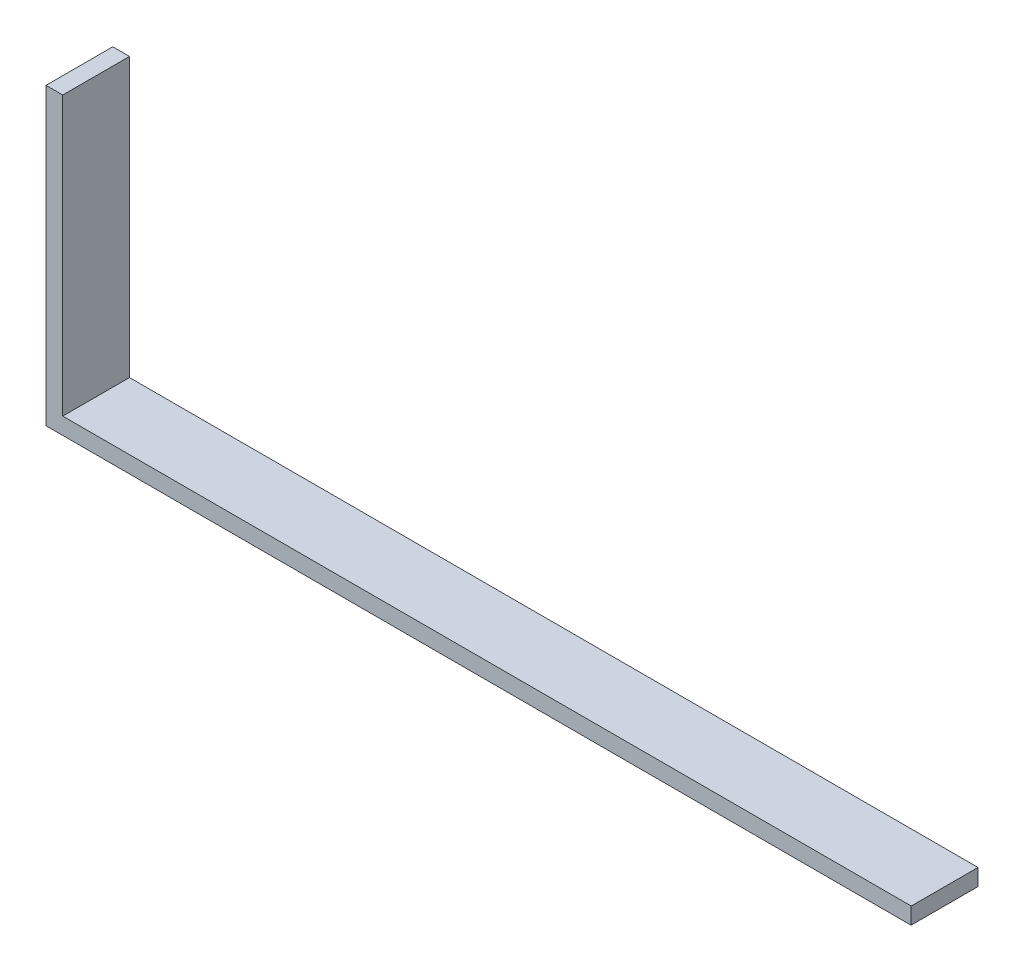
ISO-10303-21;
HEADER;
FILE_DESCRIPTION(('STEP AP214'),'2;1');
FILE_NAME('part.step','',(''),(''),'','','');
FILE_SCHEMA(('AUTOMOTIVE_DESIGN { 1 0 10303 214 1 1 1 1 }'));
ENDSEC;
DATA;
#1=APPLICATION_CONTEXT('core data for automotive mechanical design processes');
#2=APPLICATION_PROTOCOL_DEFINITION('international standard','automotive_design',2000,#1);
#3=PRODUCT_CONTEXT('',#1,'mechanical');
#4=PRODUCT('Part','Part','',(#3));
#5=PRODUCT_RELATED_PRODUCT_CATEGORY('part','',(#4));
#6=PRODUCT_DEFINITION_FORMATION('','',#4);
#7=PRODUCT_DEFINITION_CONTEXT('part definition',#1,'design');
#8=PRODUCT_DEFINITION('design','',#6,#7);
#9=PRODUCT_DEFINITION_SHAPE('','',#8);
#10=(LENGTH_UNIT() NAMED_UNIT(*) SI_UNIT(.MILLI.,.METRE.));
#11=(NAMED_UNIT(*) PLANE_ANGLE_UNIT() SI_UNIT($,.RADIAN.));
#12=(NAMED_UNIT(*) SI_UNIT($,.STERADIAN.) SOLID_ANGLE_UNIT());
#13=UNCERTAINTY_MEASURE_WITH_UNIT(LENGTH_MEASURE(1.E-05),#10,'distance_accuracy_value','');
#14=(GEOMETRIC_REPRESENTATION_CONTEXT(3) GLOBAL_UNCERTAINTY_ASSIGNED_CONTEXT((#13)) GLOBAL_UNIT_ASSIGNED_CONTEXT((#10,
#11,#12)) REPRESENTATION_CONTEXT('',''));
#15=CARTESIAN_POINT('',(0.,0.,0.));
#16=DIRECTION('',(0.,0.,1.));
#17=DIRECTION('',(1.,0.,0.));
#18=AXIS2_PLACEMENT_3D('',#15,#16,#17);
#19=CARTESIAN_POINT('',(0.,-211.585,50.8));
#20=DIRECTION('',(0.,-1.,0.));
#21=DIRECTION('',(0.,0.,-1.));
#22=AXIS2_PLACEMENT_3D('',#19,#20,#21);
#23=PLANE('',#22);
#24=DIRECTION('',(-1.,0.,0.));
#25=VECTOR('',#24,1.);
#26=CARTESIAN_POINT('',(0.,-211.585,0.));
#27=LINE('',#26,#25);
#28=CARTESIAN_POINT('',(645.545,-211.585,0.));
#29=VERTEX_POINT('',#28);
#30=CARTESIAN_POINT('',(0.,-211.585,0.));
#31=VERTEX_POINT('',#30);
#32=EDGE_CURVE('E117',#29,#31,#27,.T.);
#33=ORIENTED_EDGE('',*,*,#32,.T.);
#34=DIRECTION('',(0.,0.,-1.));
#35=VECTOR('',#34,1.);
#36=CARTESIAN_POINT('',(0.,-211.585,50.8));
#37=LINE('',#36,#35);
#38=CARTESIAN_POINT('',(0.,-211.585,50.8));
#39=VERTEX_POINT('',#38);
#40=EDGE_CURVE('E11',#39,#31,#37,.T.);
#41=ORIENTED_EDGE('',*,*,#40,.F.);
#42=DIRECTION('',(-1.,0.,0.));
#43=VECTOR('',#42,1.);
#44=CARTESIAN_POINT('',(0.,-211.585,50.8));
#45=LINE('',#44,#43);
#46=CARTESIAN_POINT('',(645.545,-211.585,50.8));
#47=VERTEX_POINT('',#46);
#48=EDGE_CURVE('E127',#47,#39,#45,.T.);
#49=ORIENTED_EDGE('',*,*,#48,.F.);
#50=DIRECTION('',(0.,0.,-1.));
#51=VECTOR('',#50,1.);
#52=CARTESIAN_POINT('',(645.545,-211.585,50.8));
#53=LINE('',#52,#51);
#54=EDGE_CURVE('E113',#47,#29,#53,.T.);
#55=ORIENTED_EDGE('',*,*,#54,.T.);
#56=EDGE_LOOP('',(#33,#41,#49,#55));
#57=FACE_BOUND('',#56,.T.);
#58=ADVANCED_FACE('F33',(#57),#23,.F.);
#59=CARTESIAN_POINT('',(0.,0.,50.8));
#60=DIRECTION('',(-1.,0.,0.));
#61=DIRECTION('',(0.,0.,1.));
#62=AXIS2_PLACEMENT_3D('',#59,#60,#61);
#63=PLANE('',#62);
#64=DIRECTION('',(0.,1.,0.));
#65=VECTOR('',#64,1.);
#66=CARTESIAN_POINT('',(0.,0.,0.));
#67=LINE('',#66,#65);
#68=CARTESIAN_POINT('',(0.,0.,0.));
#69=VERTEX_POINT('',#68);
#70=EDGE_CURVE('E120',#31,#69,#67,.T.);
#71=ORIENTED_EDGE('',*,*,#70,.T.);
#72=DIRECTION('',(0.,0.,-1.));
#73=VECTOR('',#72,1.);
#74=CARTESIAN_POINT('',(0.,0.,50.8));
#75=LINE('',#74,#73);
#76=CARTESIAN_POINT('',(0.,0.,50.8));
#77=VERTEX_POINT('',#76);
#78=EDGE_CURVE('E41',#77,#69,#75,.T.);
#79=ORIENTED_EDGE('',*,*,#78,.F.);
#80=DIRECTION('',(0.,1.,0.));
#81=VECTOR('',#80,1.);
#82=CARTESIAN_POINT('',(0.,0.,50.8));
#83=LINE('',#82,#81);
#84=EDGE_CURVE('E86',#39,#77,#83,.T.);
#85=ORIENTED_EDGE('',*,*,#84,.F.);
#86=ORIENTED_EDGE('',*,*,#40,.T.);
#87=EDGE_LOOP('',(#71,#79,#85,#86));
#88=FACE_BOUND('',#87,.T.);
#89=ADVANCED_FACE('F151',(#88),#63,.F.);
#90=CARTESIAN_POINT('',(-12.7200000000001,0.,50.8));
#91=DIRECTION('',(0.,-1.,0.));
#92=DIRECTION('',(0.,0.,-1.));
#93=AXIS2_PLACEMENT_3D('',#90,#91,#92);
#94=PLANE('',#93);
#95=DIRECTION('',(-1.,0.,0.));
#96=VECTOR('',#95,1.);
#97=CARTESIAN_POINT('',(-12.7200000000001,0.,0.));
#98=LINE('',#97,#96);
#99=CARTESIAN_POINT('',(-12.7200000000001,0.,0.));
#100=VERTEX_POINT('',#99);
#101=EDGE_CURVE('E122',#69,#100,#98,.T.);
#102=ORIENTED_EDGE('',*,*,#101,.T.);
#103=DIRECTION('',(0.,0.,-1.));
#104=VECTOR('',#103,1.);
#105=CARTESIAN_POINT('',(-12.7200000000001,0.,50.8));
#106=LINE('',#105,#104);
#107=CARTESIAN_POINT('',(-12.7200000000001,0.,50.8));
#108=VERTEX_POINT('',#107);
#109=EDGE_CURVE('E108',#108,#100,#106,.T.);
#110=ORIENTED_EDGE('',*,*,#109,.F.);
#111=DIRECTION('',(-1.,0.,0.));
#112=VECTOR('',#111,1.);
#113=CARTESIAN_POINT('',(-12.7200000000001,0.,50.8));
#114=LINE('',#113,#112);
#115=EDGE_CURVE('E99',#77,#108,#114,.T.);
#116=ORIENTED_EDGE('',*,*,#115,.F.);
#117=ORIENTED_EDGE('',*,*,#78,.T.);
#118=EDGE_LOOP('',(#102,#110,#116,#117));
#119=FACE_BOUND('',#118,.T.);
#120=ADVANCED_FACE('F133',(#119),#94,.F.);
#121=CARTESIAN_POINT('',(-12.7200000000001,-224.305,50.8));
#122=DIRECTION('',(1.,0.,0.));
#123=DIRECTION('',(0.,0.,-1.));
#124=AXIS2_PLACEMENT_3D('',#121,#122,#123);
#125=PLANE('',#124);
#126=DIRECTION('',(0.,-1.,0.));
#127=VECTOR('',#126,1.);
#128=CARTESIAN_POINT('',(-12.7200000000001,-224.305,0.));
#129=LINE('',#128,#127);
#130=CARTESIAN_POINT('',(-12.7200000000001,-224.305,0.));
#131=VERTEX_POINT('',#130);
#132=EDGE_CURVE('E107',#100,#131,#129,.T.);
#133=ORIENTED_EDGE('',*,*,#132,.T.);
#134=DIRECTION('',(0.,0.,-1.));
#135=VECTOR('',#134,1.);
#136=CARTESIAN_POINT('',(-12.7200000000001,-224.305,50.8));
#137=LINE('',#136,#135);
#138=CARTESIAN_POINT('',(-12.7200000000001,-224.305,50.8));
#139=VERTEX_POINT('',#138);
#140=EDGE_CURVE('E104',#139,#131,#137,.T.);
#141=ORIENTED_EDGE('',*,*,#140,.F.);
#142=DIRECTION('',(0.,-1.,0.));
#143=VECTOR('',#142,1.);
#144=CARTESIAN_POINT('',(-12.7200000000001,-224.305,50.8));
#145=LINE('',#144,#143);
#146=EDGE_CURVE('E93',#108,#139,#145,.T.);
#147=ORIENTED_EDGE('',*,*,#146,.F.);
#148=ORIENTED_EDGE('',*,*,#109,.T.);
#149=EDGE_LOOP('',(#133,#141,#147,#148));
#150=FACE_BOUND('',#149,.T.);
#151=ADVANCED_FACE('F105',(#150),#125,.F.);
#152=CARTESIAN_POINT('',(645.445,-224.305,50.8));
#153=DIRECTION('',(0.,1.,0.));
#154=DIRECTION('',(-1.,0.,0.));
#155=AXIS2_PLACEMENT_3D('',#152,#153,#154);
#156=PLANE('',#155);
#157=DIRECTION('',(1.,0.,0.));
#158=VECTOR('',#157,1.);
#159=CARTESIAN_POINT('',(645.445,-224.305,0.));
#160=LINE('',#159,#158);
#161=CARTESIAN_POINT('',(645.445,-224.305,0.));
#162=VERTEX_POINT('',#161);
#163=EDGE_CURVE('E72',#131,#162,#160,.T.);
#164=ORIENTED_EDGE('',*,*,#163,.T.);
#165=DIRECTION('',(0.,0.,-1.));
#166=VECTOR('',#165,1.);
#167=CARTESIAN_POINT('',(645.445,-224.305,50.8));
#168=LINE('',#167,#166);
#169=CARTESIAN_POINT('',(645.445,-224.305,50.8));
#170=VERTEX_POINT('',#169);
#171=EDGE_CURVE('E109',#170,#162,#168,.T.);
#172=ORIENTED_EDGE('',*,*,#171,.F.);
#173=DIRECTION('',(1.,0.,0.));
#174=VECTOR('',#173,1.);
#175=CARTESIAN_POINT('',(645.445,-224.305,50.8));
#176=LINE('',#175,#174);
#177=EDGE_CURVE('E97',#139,#170,#176,.T.);
#178=ORIENTED_EDGE('',*,*,#177,.F.);
#179=ORIENTED_EDGE('',*,*,#140,.T.);
#180=EDGE_LOOP('',(#164,#172,#178,#179));
#181=FACE_BOUND('',#180,.T.);
#182=ADVANCED_FACE('F111',(#181),#156,.F.);
#183=CARTESIAN_POINT('',(645.545,-211.585,50.8));
#184=DIRECTION('',(-0.99996909877822,0.00786139228599141,0.));
#185=DIRECTION('',(-0.00786139228599141,-0.99996909877822,0.));
#186=AXIS2_PLACEMENT_3D('',#183,#184,#185);
#187=PLANE('',#186);
#188=DIRECTION('',(0.00786139228599141,0.99996909877822,0.));
#189=VECTOR('',#188,1.);
#190=CARTESIAN_POINT('',(645.545,-211.585,0.));
#191=LINE('',#190,#189);
#192=EDGE_CURVE('E78',#162,#29,#191,.T.);
#193=ORIENTED_EDGE('',*,*,#192,.T.);
#194=ORIENTED_EDGE('',*,*,#54,.F.);
#195=DIRECTION('',(0.00786139228599141,0.99996909877822,0.));
#196=VECTOR('',#195,1.);
#197=CARTESIAN_POINT('',(645.545,-211.585,50.8));
#198=LINE('',#197,#196);
#199=EDGE_CURVE('E49',#170,#47,#198,.T.);
#200=ORIENTED_EDGE('',*,*,#199,.F.);
#201=ORIENTED_EDGE('',*,*,#171,.T.);
#202=EDGE_LOOP('',(#193,#194,#200,#201));
#203=FACE_BOUND('',#202,.T.);
#204=ADVANCED_FACE('F140',(#203),#187,.F.);
#205=CARTESIAN_POINT('',(0.,0.,50.8));
#206=DIRECTION('',(0.,0.,1.));
#207=DIRECTION('',(1.,0.,0.));
#208=AXIS2_PLACEMENT_3D('',#205,#206,#207);
#209=PLANE('',#208);
#210=ORIENTED_EDGE('',*,*,#48,.T.);
#211=ORIENTED_EDGE('',*,*,#84,.T.);
#212=ORIENTED_EDGE('',*,*,#115,.T.);
#213=ORIENTED_EDGE('',*,*,#146,.T.);
#214=ORIENTED_EDGE('',*,*,#177,.T.);
#215=ORIENTED_EDGE('',*,*,#199,.T.);
#216=EDGE_LOOP('',(#210,#211,#212,#213,#214,#215));
#217=FACE_BOUND('',#216,.T.);
#218=ADVANCED_FACE('F95',(#217),#209,.T.);
#219=CARTESIAN_POINT('',(0.,0.,0.));
#220=DIRECTION('',(0.,0.,1.));
#221=DIRECTION('',(1.,0.,0.));
#222=AXIS2_PLACEMENT_3D('',#219,#220,#221);
#223=PLANE('',#222);
#224=ORIENTED_EDGE('',*,*,#32,.F.);
#225=ORIENTED_EDGE('',*,*,#192,.F.);
#226=ORIENTED_EDGE('',*,*,#163,.F.);
#227=ORIENTED_EDGE('',*,*,#132,.F.);
#228=ORIENTED_EDGE('',*,*,#101,.F.);
#229=ORIENTED_EDGE('',*,*,#70,.F.);
#230=EDGE_LOOP('',(#224,#225,#226,#227,#228,#229));
#231=FACE_BOUND('',#230,.T.);
#232=ADVANCED_FACE('F136',(#231),#223,.F.);
#233=CLOSED_SHELL('',(#58,#89,#120,#151,#182,#204,#218,#232));
#234=MANIFOLD_SOLID_BREP('B2',#233);
#235=ADVANCED_BREP_SHAPE_REPRESENTATION('',(#18,#234),#14);
#236=SHAPE_DEFINITION_REPRESENTATION(#9,#235);
ENDSEC;
END-ISO-10303-21;
